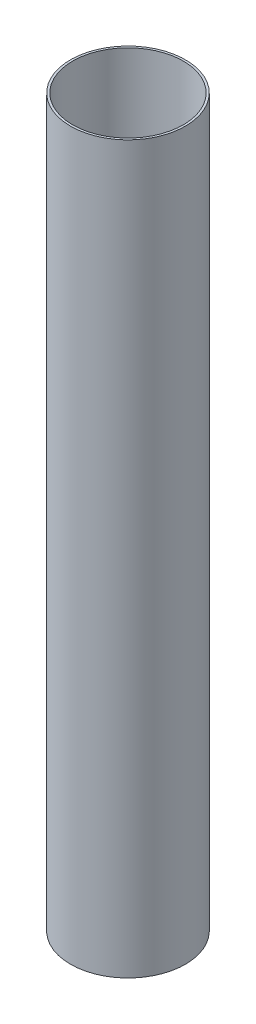
ISO-10303-21;
HEADER;
FILE_DESCRIPTION(('STEP AP214'),'2;1');
FILE_NAME('part.step','',(''),(''),'','','');
FILE_SCHEMA(('AUTOMOTIVE_DESIGN { 1 0 10303 214 1 1 1 1 }'));
ENDSEC;
DATA;
#1=APPLICATION_CONTEXT('core data for automotive mechanical design processes');
#2=APPLICATION_PROTOCOL_DEFINITION('international standard','automotive_design',2000,#1);
#3=PRODUCT_CONTEXT('',#1,'mechanical');
#4=PRODUCT('Part','Part','',(#3));
#5=PRODUCT_RELATED_PRODUCT_CATEGORY('part','',(#4));
#6=PRODUCT_DEFINITION_FORMATION('','',#4);
#7=PRODUCT_DEFINITION_CONTEXT('part definition',#1,'design');
#8=PRODUCT_DEFINITION('design','',#6,#7);
#9=PRODUCT_DEFINITION_SHAPE('','',#8);
#10=(LENGTH_UNIT() NAMED_UNIT(*) SI_UNIT(.MILLI.,.METRE.));
#11=(NAMED_UNIT(*) PLANE_ANGLE_UNIT() SI_UNIT($,.RADIAN.));
#12=(NAMED_UNIT(*) SI_UNIT($,.STERADIAN.) SOLID_ANGLE_UNIT());
#13=UNCERTAINTY_MEASURE_WITH_UNIT(LENGTH_MEASURE(1.E-05),#10,'distance_accuracy_value','');
#14=(GEOMETRIC_REPRESENTATION_CONTEXT(3) GLOBAL_UNCERTAINTY_ASSIGNED_CONTEXT((#13)) GLOBAL_UNIT_ASSIGNED_CONTEXT((#10,
#11,#12)) REPRESENTATION_CONTEXT('',''));
#15=CARTESIAN_POINT('',(0.,0.,0.));
#16=DIRECTION('',(0.,0.,1.));
#17=DIRECTION('',(1.,0.,0.));
#18=AXIS2_PLACEMENT_3D('',#15,#16,#17);
#19=CARTESIAN_POINT('',(0.,500.,0.));
#20=DIRECTION('',(0.,1.,0.));
#21=DIRECTION('',(0.,0.,1.));
#22=AXIS2_PLACEMENT_3D('',#19,#20,#21);
#23=PLANE('',#22);
#24=CARTESIAN_POINT('',(0.,500.,0.));
#25=DIRECTION('',(0.,1.,0.));
#26=DIRECTION('',(0.,0.,1.));
#27=AXIS2_PLACEMENT_3D('',#24,#25,#26);
#28=CIRCLE('',#27,39.6);
#29=CARTESIAN_POINT('',(0.,500.,39.6));
#30=VERTEX_POINT('',#29);
#31=EDGE_CURVE('E10',#30,#30,#28,.T.);
#32=ORIENTED_EDGE('',*,*,#31,.T.);
#33=EDGE_LOOP('',(#32));
#34=FACE_BOUND('',#33,.T.);
#35=CARTESIAN_POINT('',(0.,500.,0.));
#36=DIRECTION('',(0.,1.,0.));
#37=DIRECTION('',(0.,0.,1.));
#38=AXIS2_PLACEMENT_3D('',#35,#36,#37);
#39=CIRCLE('',#38,38.1);
#40=CARTESIAN_POINT('',(0.,500.,38.1));
#41=VERTEX_POINT('',#40);
#42=EDGE_CURVE('E49',#41,#41,#39,.T.);
#43=ORIENTED_EDGE('',*,*,#42,.F.);
#44=EDGE_LOOP('',(#43));
#45=FACE_BOUND('',#44,.T.);
#46=ADVANCED_FACE('F31',(#34,#45),#23,.T.);
#47=CARTESIAN_POINT('',(0.,0.,0.));
#48=DIRECTION('',(0.,1.,0.));
#49=DIRECTION('',(0.,0.,1.));
#50=AXIS2_PLACEMENT_3D('',#47,#48,#49);
#51=PLANE('',#50);
#52=CARTESIAN_POINT('',(0.,0.,0.));
#53=DIRECTION('',(0.,1.,0.));
#54=DIRECTION('',(0.,0.,1.));
#55=AXIS2_PLACEMENT_3D('',#52,#53,#54);
#56=CIRCLE('',#55,39.6);
#57=CARTESIAN_POINT('',(0.,0.,39.6));
#58=VERTEX_POINT('',#57);
#59=EDGE_CURVE('E44',#58,#58,#56,.T.);
#60=ORIENTED_EDGE('',*,*,#59,.F.);
#61=EDGE_LOOP('',(#60));
#62=FACE_BOUND('',#61,.T.);
#63=CARTESIAN_POINT('',(0.,0.,0.));
#64=DIRECTION('',(0.,1.,0.));
#65=DIRECTION('',(0.,0.,1.));
#66=AXIS2_PLACEMENT_3D('',#63,#64,#65);
#67=CIRCLE('',#66,38.1);
#68=CARTESIAN_POINT('',(0.,0.,38.1));
#69=VERTEX_POINT('',#68);
#70=EDGE_CURVE('E51',#69,#69,#67,.T.);
#71=ORIENTED_EDGE('',*,*,#70,.T.);
#72=EDGE_LOOP('',(#71));
#73=FACE_BOUND('',#72,.T.);
#74=ADVANCED_FACE('F71',(#62,#73),#51,.F.);
#75=CARTESIAN_POINT('',(0.,500.,0.));
#76=DIRECTION('',(0.,-1.,0.));
#77=DIRECTION('',(0.,0.,-1.));
#78=AXIS2_PLACEMENT_3D('',#75,#76,#77);
#79=CYLINDRICAL_SURFACE('',#78,39.6);
#80=CARTESIAN_POINT('',(-39.5494627017865,310.,-2.));
#81=CARTESIAN_POINT('',(-39.5494633805638,309.887736012651,-1.99999504587905));
#82=CARTESIAN_POINT('',(-39.549945843696,309.775392447069,-1.99051584970761));
#83=CARTESIAN_POINT('',(-39.5518239004202,309.553804592069,-1.95283595262459));
#84=CARTESIAN_POINT('',(-39.5532205694095,309.444564110966,-1.92461320275257));
#85=CARTESIAN_POINT('',(-39.5567684293352,309.232424406619,-1.85025641437459));
#86=CARTESIAN_POINT('',(-39.5589192350897,309.129521977642,-1.80413151826623));
#87=CARTESIAN_POINT('',(-39.5637325299873,308.932948066749,-1.69529381609787));
#88=CARTESIAN_POINT('',(-39.5663948984394,308.839274415393,-1.63258492132481));
#89=CARTESIAN_POINT('',(-39.5719344549867,308.663692768875,-1.49228741624869));
#90=CARTESIAN_POINT('',(-39.5748118346272,308.581795459373,-1.41468543939058));
#91=CARTESIAN_POINT('',(-39.5804553835984,308.432182374286,-1.24683135036735));
#92=CARTESIAN_POINT('',(-39.5832215483825,308.364467178025,-1.15657872168844));
#93=CARTESIAN_POINT('',(-39.5883324321443,308.245111062589,-0.965929298706163));
#94=CARTESIAN_POINT('',(-39.5906769325991,308.193478467966,-0.865527286451754));
#95=CARTESIAN_POINT('',(-39.59467835378,308.107806643397,-0.657465875900597));
#96=CARTESIAN_POINT('',(-39.5963352797874,308.073767278318,-0.549806533354487));
#97=CARTESIAN_POINT('',(-39.5987735538844,308.024276396142,-0.330384833901962));
#98=CARTESIAN_POINT('',(-39.5995556550983,308.008808889952,-0.218626091859427));
#99=CARTESIAN_POINT('',(-39.6001586710762,307.996851446529,0.00590408443600559));
#100=CARTESIAN_POINT('',(-39.5999795935225,308.00036135762,0.118675510587931));
#101=CARTESIAN_POINT('',(-39.5986810661567,308.026245848579,0.341921619670147));
#102=CARTESIAN_POINT('',(-39.5975624742331,308.048603218541,0.452398303700231));
#103=CARTESIAN_POINT('',(-39.5945118998958,308.111521304833,0.668028545321543));
#104=CARTESIAN_POINT('',(-39.5925799140208,308.152082098622,0.773182080259612));
#105=CARTESIAN_POINT('',(-39.5881186965578,308.250275277546,0.97523650632644));
#106=CARTESIAN_POINT('',(-39.5855891908089,308.307915502356,1.07213358128003));
#107=CARTESIAN_POINT('',(-39.5802177883049,308.438625623174,1.25488282436368));
#108=CARTESIAN_POINT('',(-39.5773758892964,308.511695630481,1.3407349128165));
#109=CARTESIAN_POINT('',(-39.5716959872028,308.67128841554,1.49905753215066));
#110=CARTESIAN_POINT('',(-39.5688579920121,308.757826124816,1.57151301285576));
#111=CARTESIAN_POINT('',(-39.5635090345074,308.941845375337,1.70086972649382));
#112=CARTESIAN_POINT('',(-39.5609980722815,309.039326919536,1.75777095523065));
#113=CARTESIAN_POINT('',(-39.5565865844047,309.242475796353,1.85440264149442));
#114=CARTESIAN_POINT('',(-39.5546860789604,309.348143399792,1.8941325306516));
#115=CARTESIAN_POINT('',(-39.551710595398,309.564660765748,1.95528368710618));
#116=CARTESIAN_POINT('',(-39.5506356109452,309.675510488492,1.97670509489862));
#117=CARTESIAN_POINT('',(-39.5494335672349,309.899114365366,2.00061259424068));
#118=CARTESIAN_POINT('',(-39.5493054621971,310.011866280577,2.00311957588068));
#119=CARTESIAN_POINT('',(-39.5500088934241,310.236189175193,1.98918157644528));
#120=CARTESIAN_POINT('',(-39.5508404264499,310.347760158582,1.97273665933819));
#121=CARTESIAN_POINT('',(-39.5533684580109,310.566495403161,1.92137900035167));
#122=CARTESIAN_POINT('',(-39.5550645085958,310.673661915484,1.88647582227807));
#123=CARTESIAN_POINT('',(-39.5591300351847,310.880615503453,1.79920209433135));
#124=CARTESIAN_POINT('',(-39.5614995151658,310.980402535512,1.74683144129611));
#125=CARTESIAN_POINT('',(-39.5666473849614,311.169860676133,1.62605576855342));
#126=CARTESIAN_POINT('',(-39.5694261318023,311.259522830308,1.55763671773181));
#127=CARTESIAN_POINT('',(-39.5750780885359,311.426095957461,1.40672691157965));
#128=CARTESIAN_POINT('',(-39.5779512990441,311.50300684735,1.3242360645638));
#129=CARTESIAN_POINT('',(-39.5834714039456,311.641964439014,1.14743454819509));
#130=CARTESIAN_POINT('',(-39.586118091485,311.703997646139,1.05311326535955));
#131=CARTESIAN_POINT('',(-39.5908839104221,311.811346719011,0.855381951928482));
#132=CARTESIAN_POINT('',(-39.5930030441506,311.85666265862,0.751971961492811));
#133=CARTESIAN_POINT('',(-39.5964739417287,311.929267252047,0.539048841782948));
#134=CARTESIAN_POINT('',(-39.5978260728767,311.95656453558,0.429538661377586));
#135=CARTESIAN_POINT('',(-39.5996120427221,311.992385207519,0.20748247365842));
#136=CARTESIAN_POINT('',(-39.6000458867397,312.000908704693,0.0949364839364922));
#137=CARTESIAN_POINT('',(-39.5999464123695,311.998938814893,-0.129862626807722));
#138=CARTESIAN_POINT('',(-39.5994141704439,311.988466593924,-0.242115934398362));
#139=CARTESIAN_POINT('',(-39.5974445600472,311.948846293923,-0.463268516234422));
#140=CARTESIAN_POINT('',(-39.5960071898745,311.919698179786,-0.57216778417464));
#141=CARTESIAN_POINT('',(-39.5923890304609,311.843557850397,-0.783525415372076));
#142=CARTESIAN_POINT('',(-39.5902082360714,311.796565511564,-0.885983734016159));
#143=CARTESIAN_POINT('',(-39.5853484727192,311.686074312056,-1.08155784342284));
#144=CARTESIAN_POINT('',(-39.582669518964,311.622575955236,-1.17467391924253));
#145=CARTESIAN_POINT('',(-39.5771115452285,311.480799321402,-1.34902612360988));
#146=CARTESIAN_POINT('',(-39.5742323270256,311.402506265098,-1.43025022732235));
#147=CARTESIAN_POINT('',(-39.5685996844676,311.233372865268,-1.57842742405221));
#148=CARTESIAN_POINT('',(-39.5658462912308,311.142529439967,-1.64537700162206));
#149=CARTESIAN_POINT('',(-39.5607739696856,310.950801377624,-1.76313676696711));
#150=CARTESIAN_POINT('',(-39.5584554653329,310.849907087562,-1.81393123898209));
#151=CARTESIAN_POINT('',(-39.5545210984327,310.641086126657,-1.89779871956404));
#152=CARTESIAN_POINT('',(-39.5529044066169,310.533167929751,-1.93089265404535));
#153=CARTESIAN_POINT('',(-39.5509839051267,310.353816329351,-1.96974185182653));
#154=CARTESIAN_POINT('',(-39.5504159708997,310.283544541887,-1.98107416404735));
#155=CARTESIAN_POINT('',(-39.5496551544123,310.142192479211,-1.99620480389874));
#156=CARTESIAN_POINT('',(-39.5494622718236,310.071112204706,-2.00000313812534));
#157=CARTESIAN_POINT('',(-39.5494627017865,310.,-2.));
#158=B_SPLINE_CURVE_WITH_KNOTS('',3,(#80,#81,#82,#83,#84,#85,#86,#87,#88,#89,#90,#91,#92,#93,
#94,#95,#96,#97,#98,#99,#100,#101,#102,#103,#104,#105,#106,#107,#108,#109,#110,#111,#112,#113,
#114,#115,#116,#117,#118,#119,#120,#121,#122,#123,#124,#125,#126,#127,#128,#129,#130,#131,#132,
#133,#134,#135,#136,#137,#138,#139,#140,#141,#142,#143,#144,#145,#146,#147,#148,#149,#150,#151,
#152,#153,#154,#155,#156,#157),.UNSPECIFIED.,.T.,.F.,(4,2,2,2,2,2,2,2,2,2,2,2,2,2,2,2,2,2,2,2,2,
2,2,2,2,2,2,2,2,2,2,2,2,2,2,2,2,2,4),(0.,0.336532374480321,0.673461331350422,1.01021844882466,
1.3468962138512,1.6838775726605,2.02087269410049,2.35804195956898,2.69520863520631,
3.03208482491552,3.3689583221781,3.70552454780734,4.0420922056053,4.37881459215504,
4.7155394076441,5.05264024204074,5.38974116737818,5.72685324987089,6.06396274542081,
6.40069986487464,6.73743584774376,7.07399752779828,7.41056119560619,7.74742022512119,
8.08428144953762,8.42144707458374,8.75861120988655,9.09561374904256,9.43261433575895,
9.76923964973544,10.1058655964895,10.4424938746211,10.7791118781877,11.1160679440222,
11.4531068978362,11.7904727288726,12.1274388330164,12.3406112013016,12.5537833829536),.UNSPECIFIED.);
#159=CARTESIAN_POINT('',(-39.5494627017865,310.,-2.));
#160=VERTEX_POINT('',#159);
#161=EDGE_CURVE('E56',#160,#160,#158,.T.);
#162=ORIENTED_EDGE('',*,*,#161,.F.);
#163=EDGE_LOOP('',(#162));
#164=FACE_BOUND('',#163,.T.);
#165=ORIENTED_EDGE('',*,*,#31,.F.);
#166=EDGE_LOOP('',(#165));
#167=FACE_BOUND('',#166,.T.);
#168=ORIENTED_EDGE('',*,*,#59,.T.);
#169=EDGE_LOOP('',(#168));
#170=FACE_BOUND('',#169,.T.);
#171=ADVANCED_FACE('F33',(#164,#167,#170),#79,.T.);
#172=CARTESIAN_POINT('',(0.,500.,0.));
#173=DIRECTION('',(0.,-1.,0.));
#174=DIRECTION('',(0.,0.,-1.));
#175=AXIS2_PLACEMENT_3D('',#172,#173,#174);
#176=CYLINDRICAL_SURFACE('',#175,38.1);
#177=CARTESIAN_POINT('',(-38.0474703495515,310.,-2.));
#178=CARTESIAN_POINT('',(-38.0474710546729,310.112257811472,-1.99999504824444));
#179=CARTESIAN_POINT('',(-38.0479725095062,310.224595050209,-1.99051689069613));
#180=CARTESIAN_POINT('',(-38.0499244771662,310.446170001832,-1.95284136009361));
#181=CARTESIAN_POINT('',(-38.051376105727,310.555403913125,-1.92462197973472));
#182=CARTESIAN_POINT('',(-38.055063538444,310.767530443873,-1.8502746673313));
#183=CARTESIAN_POINT('',(-38.0572989402149,310.870426285452,-1.80415592343538));
#184=CARTESIAN_POINT('',(-38.0623015276112,311.066988324986,-1.69533327170804));
#185=CARTESIAN_POINT('',(-38.0650685883528,311.160656682626,-1.63263325742968));
#186=CARTESIAN_POINT('',(-38.0708261770562,311.336235738689,-1.49235126201491));
#187=CARTESIAN_POINT('',(-38.0738169182536,311.418134994641,-1.4147549669144));
#188=CARTESIAN_POINT('',(-38.0796828664912,311.567753391474,-1.24691190662656));
#189=CARTESIAN_POINT('',(-38.0825580687929,311.635471951259,-1.15666462328162));
#190=CARTESIAN_POINT('',(-38.0878706264306,311.754838894446,-0.966020556673358));
#191=CARTESIAN_POINT('',(-38.090307735729,311.80647825945,-0.865618119322077));
#192=CARTESIAN_POINT('',(-38.0944673048082,311.892163109295,-0.657553579932393));
#193=CARTESIAN_POINT('',(-38.0961897704042,311.926208737302,-0.549891536975474));
#194=CARTESIAN_POINT('',(-38.098724517484,311.975709166388,-0.330470140885542));
#195=CARTESIAN_POINT('',(-38.0995376446182,311.991181241157,-0.218714694538194));
#196=CARTESIAN_POINT('',(-38.1001649240089,312.003148683517,0.00580989691479161));
#197=CARTESIAN_POINT('',(-38.0999790847449,311.999644212187,0.118579033407788));
#198=CARTESIAN_POINT('',(-38.0986300839424,311.973772359198,0.341812932397968));
#199=CARTESIAN_POINT('',(-38.0974678856047,311.951423567817,0.452279856054694));
#200=CARTESIAN_POINT('',(-38.094298171997,311.888526298357,0.667892017040114));
#201=CARTESIAN_POINT('',(-38.0922906529168,311.847977738244,0.773037230379499));
#202=CARTESIAN_POINT('',(-38.0876547545013,311.74981078611,0.97508111150013));
#203=CARTESIAN_POINT('',(-38.0850260675225,311.692183932178,1.0719756605534));
#204=CARTESIAN_POINT('',(-38.0794438291461,311.561502382468,1.25472272253969));
#205=CARTESIAN_POINT('',(-38.0764902752068,311.488447565982,1.34057514907065));
#206=CARTESIAN_POINT('',(-38.0705866727919,311.328878772366,1.49890936775546));
#207=CARTESIAN_POINT('',(-38.0676366328434,311.242348665247,1.57137490546292));
#208=CARTESIAN_POINT('',(-38.062076216131,311.058342199417,1.70075307877792));
#209=CARTESIAN_POINT('',(-38.0594658394647,310.960865837566,1.75766570992631));
#210=CARTESIAN_POINT('',(-38.0548793976098,310.757723952842,1.85432115775649));
#211=CARTESIAN_POINT('',(-38.0529033554951,310.652058132252,1.8940633498848));
#212=CARTESIAN_POINT('',(-38.049809293279,310.435541280845,1.95523886176805));
#213=CARTESIAN_POINT('',(-38.0486912660644,310.324690293023,1.97667233330474));
#214=CARTESIAN_POINT('',(-38.0474406331002,310.101091388368,2.000601856092));
#215=CARTESIAN_POINT('',(-38.0473068530827,309.988345892893,2.00312047400902));
#216=CARTESIAN_POINT('',(-38.0480367349632,309.764033909175,1.98920769857108));
#217=CARTESIAN_POINT('',(-38.0489003932195,309.65246741663,1.97277637440304));
#218=CARTESIAN_POINT('',(-38.0515267397444,309.433743868603,1.9214488615748));
#219=CARTESIAN_POINT('',(-38.0532889245172,309.326584379927,1.88656301363005));
#220=CARTESIAN_POINT('',(-38.0575132873922,309.119641722654,1.79932720118941));
#221=CARTESIAN_POINT('',(-38.0599754699645,309.019858601165,1.74697712516991));
#222=CARTESIAN_POINT('',(-38.0653251822079,308.830397363387,1.62624101088174));
#223=CARTESIAN_POINT('',(-38.0682131128087,308.740728914199,1.55783982084901));
#224=CARTESIAN_POINT('',(-38.0740874227916,308.574139646967,1.40696525810437));
#225=CARTESIAN_POINT('',(-38.0770738028636,308.497218918284,1.32449178675552));
#226=CARTESIAN_POINT('',(-38.0828118626823,308.358232684494,1.14771681877241));
#227=CARTESIAN_POINT('',(-38.085563310365,308.296181760828,1.05340384918464));
#228=CARTESIAN_POINT('',(-38.0905181043043,308.188796234988,0.855685019909688));
#229=CARTESIAN_POINT('',(-38.0927214531285,308.143461554508,0.752279202819858));
#230=CARTESIAN_POINT('',(-38.0963306314498,308.070820873178,0.539364117196024));
#231=CARTESIAN_POINT('',(-38.0977368727362,308.043505562249,0.429858032258721));
#232=CARTESIAN_POINT('',(-38.099594997294,308.007648516355,0.207806369349558));
#233=CARTESIAN_POINT('',(-38.1000468866774,307.999106661159,0.0952608108480844));
#234=CARTESIAN_POINT('',(-38.0999454073661,308.001040139863,-0.129530397813847));
#235=CARTESIAN_POINT('',(-38.0993932471833,308.011492611464,-0.241776245882464));
#236=CARTESIAN_POINT('',(-38.0973482007726,308.051070749542,-0.462917101544333));
#237=CARTESIAN_POINT('',(-38.0958553127914,308.080196450819,-0.571812102892347));
#238=CARTESIAN_POINT('',(-38.0920967402758,308.156289494421,-0.783164634778044));
#239=CARTESIAN_POINT('',(-38.0898310517601,308.203256928662,-0.885622132147983));
#240=CARTESIAN_POINT('',(-38.0847816081437,308.313696433619,-1.08119919158481));
#241=CARTESIAN_POINT('',(-38.0819978684971,308.377168012017,-1.17431903207928));
#242=CARTESIAN_POINT('',(-38.0762217464145,308.518896600715,-1.34869209117096));
#243=CARTESIAN_POINT('',(-38.0732291392658,308.597169695064,-1.42993222880055));
#244=CARTESIAN_POINT('',(-38.067374161198,308.766266073007,-1.57814507251644));
#245=CARTESIAN_POINT('',(-38.0645118224714,308.857092436661,-1.64511426681493));
#246=CARTESIAN_POINT('',(-38.0592381499375,309.048794419642,-1.7629189145605));
#247=CARTESIAN_POINT('',(-38.056827274757,309.149680100214,-1.81373799777492));
#248=CARTESIAN_POINT('',(-38.0527355823806,309.358489383148,-1.89765550865307));
#249=CARTESIAN_POINT('',(-38.051053904616,309.466404515608,-1.93077483563257));
#250=CARTESIAN_POINT('',(-38.0490548295057,309.645823578622,-1.96967976640889));
#251=CARTESIAN_POINT('',(-38.0484632762815,309.716165789106,-1.98103530385917));
#252=CARTESIAN_POINT('',(-38.0476708129232,309.857661354013,-1.99619698707609));
#253=CARTESIAN_POINT('',(-38.0474699024176,309.928814707665,-2.00000314002351));
#254=CARTESIAN_POINT('',(-38.0474703495515,310.,-2.));
#255=B_SPLINE_CURVE_WITH_KNOTS('',3,(#177,#178,#179,#180,#181,#182,#183,#184,#185,#186,#187,
#188,#189,#190,#191,#192,#193,#194,#195,#196,#197,#198,#199,#200,#201,#202,#203,#204,#205,#206,
#207,#208,#209,#210,#211,#212,#213,#214,#215,#216,#217,#218,#219,#220,#221,#222,#223,#224,#225,
#226,#227,#228,#229,#230,#231,#232,#233,#234,#235,#236,#237,#238,#239,#240,#241,#242,#243,#244,
#245,#246,#247,#248,#249,#250,#251,#252,#253,#254),.UNSPECIFIED.,.T.,.F.,(4,2,2,2,2,2,2,2,2,2,2,
2,2,2,2,2,2,2,2,2,2,2,2,2,2,2,2,2,2,2,2,2,2,2,2,2,2,2,4),(0.,0.336513577634106,
0.673423014300277,1.01015973597304,1.34681745646643,1.68380030833232,2.02079696633468,
2.35798229784572,2.69516488554304,3.03203364469975,3.3688995444098,3.70543350783238,
4.04196898815414,4.37867149380354,4.71537663391156,5.05248795435352,5.38959937144798,
5.7267230495211,6.06384393276683,6.40056254459728,6.73727992705984,7.07380883453107,
7.41033989106019,7.7471899097485,8.08404228961932,8.42122365000225,8.75840343087268,
9.09540886411219,9.43241213906011,9.76901005261787,10.1056085934819,10.4422088684495,
10.7787991037801,11.1157572184167,11.4527981560576,11.7901796467296,12.127161882813,
12.3405531815528,12.5539442773203),.UNSPECIFIED.);
#256=CARTESIAN_POINT('',(-38.0474703495515,310.,-2.));
#257=VERTEX_POINT('',#256);
#258=EDGE_CURVE('E35',#257,#257,#255,.T.);
#259=ORIENTED_EDGE('',*,*,#258,.F.);
#260=EDGE_LOOP('',(#259));
#261=FACE_BOUND('',#260,.T.);
#262=ORIENTED_EDGE('',*,*,#42,.T.);
#263=EDGE_LOOP('',(#262));
#264=FACE_BOUND('',#263,.T.);
#265=ORIENTED_EDGE('',*,*,#70,.F.);
#266=EDGE_LOOP('',(#265));
#267=FACE_BOUND('',#266,.T.);
#268=ADVANCED_FACE('F65',(#261,#264,#267),#176,.F.);
#269=CARTESIAN_POINT('',(-39.601,310.,0.));
#270=DIRECTION('',(1.,0.,0.));
#271=DIRECTION('',(0.,0.,-1.));
#272=AXIS2_PLACEMENT_3D('',#269,#270,#271);
#273=CYLINDRICAL_SURFACE('',#272,2.);
#274=ORIENTED_EDGE('',*,*,#258,.T.);
#275=EDGE_LOOP('',(#274));
#276=FACE_BOUND('',#275,.T.);
#277=ORIENTED_EDGE('',*,*,#161,.T.);
#278=EDGE_LOOP('',(#277));
#279=FACE_BOUND('',#278,.T.);
#280=ADVANCED_FACE('F62',(#276,#279),#273,.F.);
#281=CLOSED_SHELL('',(#46,#74,#171,#268,#280));
#282=MANIFOLD_SOLID_BREP('B2',#281);
#283=ADVANCED_BREP_SHAPE_REPRESENTATION('',(#18,#282),#14);
#284=SHAPE_DEFINITION_REPRESENTATION(#9,#283);
ENDSEC;
END-ISO-10303-21;
